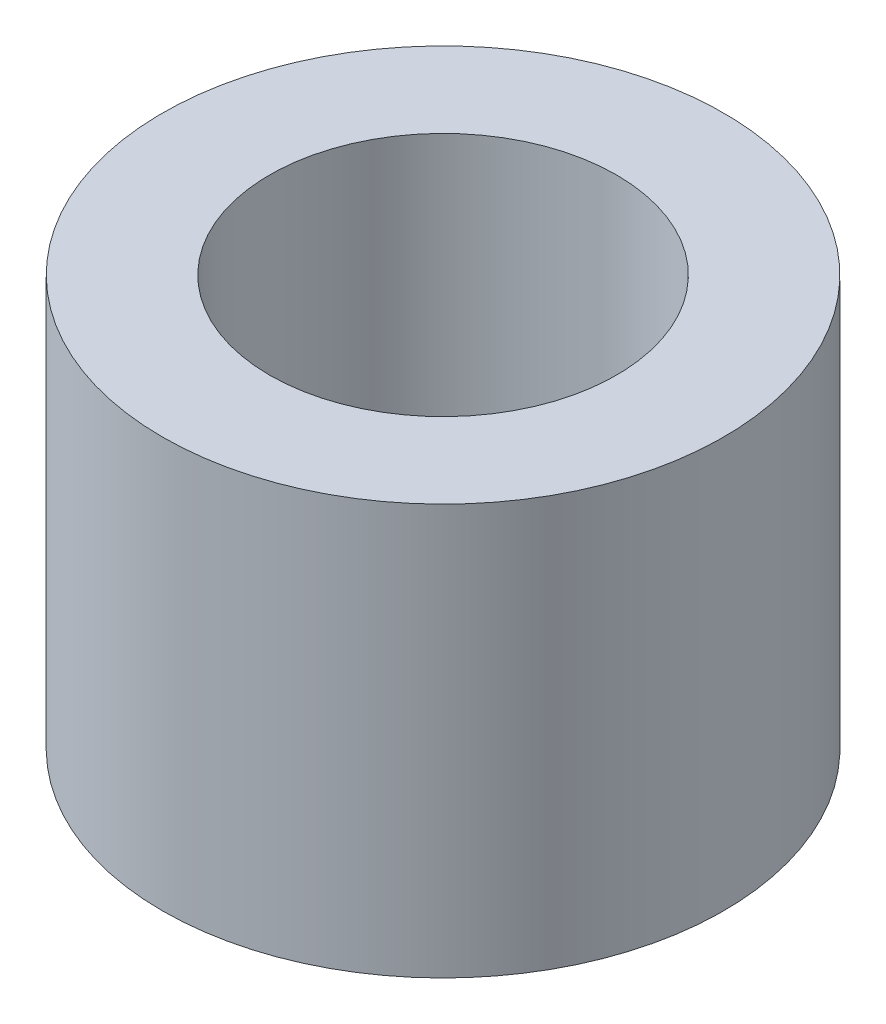
ISO-10303-21;
HEADER;
FILE_DESCRIPTION(('STEP AP214'),'2;1');
FILE_NAME('part.step','',(''),(''),'','','');
FILE_SCHEMA(('AUTOMOTIVE_DESIGN { 1 0 10303 214 1 1 1 1 }'));
ENDSEC;
DATA;
#1=APPLICATION_CONTEXT('core data for automotive mechanical design processes');
#2=APPLICATION_PROTOCOL_DEFINITION('international standard','automotive_design',2000,#1);
#3=PRODUCT_CONTEXT('',#1,'mechanical');
#4=PRODUCT('Part','Part','',(#3));
#5=PRODUCT_RELATED_PRODUCT_CATEGORY('part','',(#4));
#6=PRODUCT_DEFINITION_FORMATION('','',#4);
#7=PRODUCT_DEFINITION_CONTEXT('part definition',#1,'design');
#8=PRODUCT_DEFINITION('design','',#6,#7);
#9=PRODUCT_DEFINITION_SHAPE('','',#8);
#10=(LENGTH_UNIT() NAMED_UNIT(*) SI_UNIT(.MILLI.,.METRE.));
#11=(NAMED_UNIT(*) PLANE_ANGLE_UNIT() SI_UNIT($,.RADIAN.));
#12=(NAMED_UNIT(*) SI_UNIT($,.STERADIAN.) SOLID_ANGLE_UNIT());
#13=UNCERTAINTY_MEASURE_WITH_UNIT(LENGTH_MEASURE(1.E-05),#10,'distance_accuracy_value','');
#14=(GEOMETRIC_REPRESENTATION_CONTEXT(3) GLOBAL_UNCERTAINTY_ASSIGNED_CONTEXT((#13)) GLOBAL_UNIT_ASSIGNED_CONTEXT((#10,
#11,#12)) REPRESENTATION_CONTEXT('',''));
#15=CARTESIAN_POINT('',(0.,0.,0.));
#16=DIRECTION('',(0.,0.,1.));
#17=DIRECTION('',(1.,0.,0.));
#18=AXIS2_PLACEMENT_3D('',#15,#16,#17);
#19=CARTESIAN_POINT('',(0.,7.6596,0.));
#20=DIRECTION('',(0.,1.,0.));
#21=DIRECTION('',(0.,0.,1.));
#22=AXIS2_PLACEMENT_3D('',#19,#20,#21);
#23=PLANE('',#22);
#24=CARTESIAN_POINT('',(0.,7.6596,0.));
#25=DIRECTION('',(0.,1.,0.));
#26=DIRECTION('',(0.,0.,1.));
#27=AXIS2_PLACEMENT_3D('',#24,#25,#26);
#28=CIRCLE('',#27,5.2375);
#29=CARTESIAN_POINT('',(0.,7.6596,5.2375));
#30=VERTEX_POINT('',#29);
#31=EDGE_CURVE('E11',#30,#30,#28,.T.);
#32=ORIENTED_EDGE('',*,*,#31,.T.);
#33=EDGE_LOOP('',(#32));
#34=FACE_BOUND('',#33,.T.);
#35=CARTESIAN_POINT('',(0.,7.6596,0.));
#36=DIRECTION('',(0.,1.,0.));
#37=DIRECTION('',(0.,0.,1.));
#38=AXIS2_PLACEMENT_3D('',#35,#36,#37);
#39=CIRCLE('',#38,3.2375);
#40=CARTESIAN_POINT('',(0.,7.6596,3.2375));
#41=VERTEX_POINT('',#40);
#42=EDGE_CURVE('E52',#41,#41,#39,.T.);
#43=ORIENTED_EDGE('',*,*,#42,.F.);
#44=EDGE_LOOP('',(#43));
#45=FACE_BOUND('',#44,.T.);
#46=ADVANCED_FACE('F41',(#34,#45),#23,.T.);
#47=CARTESIAN_POINT('',(0.,0.,0.));
#48=DIRECTION('',(0.,1.,0.));
#49=DIRECTION('',(0.,0.,1.));
#50=AXIS2_PLACEMENT_3D('',#47,#48,#49);
#51=PLANE('',#50);
#52=CARTESIAN_POINT('',(0.,0.,0.));
#53=DIRECTION('',(0.,1.,0.));
#54=DIRECTION('',(0.,0.,1.));
#55=AXIS2_PLACEMENT_3D('',#52,#53,#54);
#56=CIRCLE('',#55,5.2375);
#57=CARTESIAN_POINT('',(0.,0.,5.2375));
#58=VERTEX_POINT('',#57);
#59=EDGE_CURVE('E45',#58,#58,#56,.T.);
#60=ORIENTED_EDGE('',*,*,#59,.F.);
#61=EDGE_LOOP('',(#60));
#62=FACE_BOUND('',#61,.T.);
#63=CARTESIAN_POINT('',(0.,0.,0.));
#64=DIRECTION('',(0.,1.,0.));
#65=DIRECTION('',(0.,0.,1.));
#66=AXIS2_PLACEMENT_3D('',#63,#64,#65);
#67=CIRCLE('',#66,3.2375);
#68=CARTESIAN_POINT('',(0.,0.,3.2375));
#69=VERTEX_POINT('',#68);
#70=EDGE_CURVE('E54',#69,#69,#67,.T.);
#71=ORIENTED_EDGE('',*,*,#70,.T.);
#72=EDGE_LOOP('',(#71));
#73=FACE_BOUND('',#72,.T.);
#74=ADVANCED_FACE('F64',(#62,#73),#51,.F.);
#75=CARTESIAN_POINT('',(0.,7.6596,0.));
#76=DIRECTION('',(0.,-1.,0.));
#77=DIRECTION('',(0.,0.,-1.));
#78=AXIS2_PLACEMENT_3D('',#75,#76,#77);
#79=CYLINDRICAL_SURFACE('',#78,5.2375);
#80=ORIENTED_EDGE('',*,*,#31,.F.);
#81=EDGE_LOOP('',(#80));
#82=FACE_BOUND('',#81,.T.);
#83=ORIENTED_EDGE('',*,*,#59,.T.);
#84=EDGE_LOOP('',(#83));
#85=FACE_BOUND('',#84,.T.);
#86=ADVANCED_FACE('F43',(#82,#85),#79,.T.);
#87=CARTESIAN_POINT('',(0.,7.6596,0.));
#88=DIRECTION('',(0.,-1.,0.));
#89=DIRECTION('',(0.,0.,-1.));
#90=AXIS2_PLACEMENT_3D('',#87,#88,#89);
#91=CYLINDRICAL_SURFACE('',#90,3.2375);
#92=ORIENTED_EDGE('',*,*,#42,.T.);
#93=EDGE_LOOP('',(#92));
#94=FACE_BOUND('',#93,.T.);
#95=ORIENTED_EDGE('',*,*,#70,.F.);
#96=EDGE_LOOP('',(#95));
#97=FACE_BOUND('',#96,.T.);
#98=ADVANCED_FACE('F60',(#94,#97),#91,.F.);
#99=CLOSED_SHELL('',(#46,#74,#86,#98));
#100=MANIFOLD_SOLID_BREP('B2',#99);
#101=ADVANCED_BREP_SHAPE_REPRESENTATION('',(#18,#100),#14);
#102=SHAPE_DEFINITION_REPRESENTATION(#9,#101);
ENDSEC;
END-ISO-10303-21;
